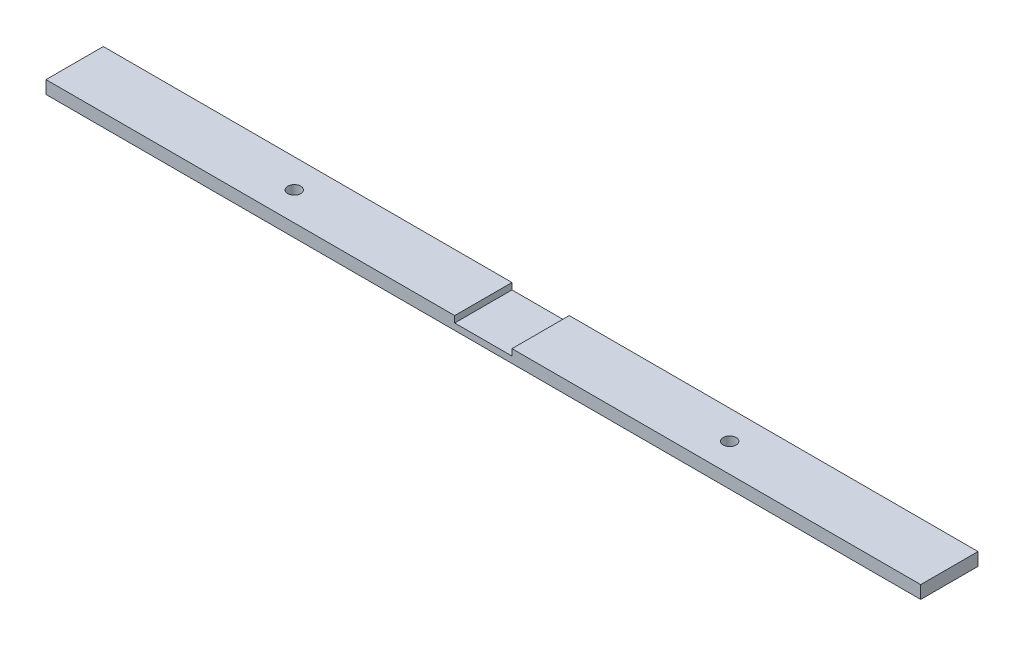
ISO-10303-21;
HEADER;
FILE_DESCRIPTION(('STEP AP214'),'2;1');
FILE_NAME('part.step','',(''),(''),'','','');
FILE_SCHEMA(('AUTOMOTIVE_DESIGN { 1 0 10303 214 1 1 1 1 }'));
ENDSEC;
DATA;
#1=APPLICATION_CONTEXT('core data for automotive mechanical design processes');
#2=APPLICATION_PROTOCOL_DEFINITION('international standard','automotive_design',2000,#1);
#3=PRODUCT_CONTEXT('',#1,'mechanical');
#4=PRODUCT('Part','Part','',(#3));
#5=PRODUCT_RELATED_PRODUCT_CATEGORY('part','',(#4));
#6=PRODUCT_DEFINITION_FORMATION('','',#4);
#7=PRODUCT_DEFINITION_CONTEXT('part definition',#1,'design');
#8=PRODUCT_DEFINITION('design','',#6,#7);
#9=PRODUCT_DEFINITION_SHAPE('','',#8);
#10=(LENGTH_UNIT() NAMED_UNIT(*) SI_UNIT(.MILLI.,.METRE.));
#11=(NAMED_UNIT(*) PLANE_ANGLE_UNIT() SI_UNIT($,.RADIAN.));
#12=(NAMED_UNIT(*) SI_UNIT($,.STERADIAN.) SOLID_ANGLE_UNIT());
#13=UNCERTAINTY_MEASURE_WITH_UNIT(LENGTH_MEASURE(1.E-05),#10,'distance_accuracy_value','');
#14=(GEOMETRIC_REPRESENTATION_CONTEXT(3) GLOBAL_UNCERTAINTY_ASSIGNED_CONTEXT((#13)) GLOBAL_UNIT_ASSIGNED_CONTEXT((#10,
#11,#12)) REPRESENTATION_CONTEXT('',''));
#15=CARTESIAN_POINT('',(0.,0.,0.));
#16=DIRECTION('',(0.,0.,1.));
#17=DIRECTION('',(1.,0.,0.));
#18=AXIS2_PLACEMENT_3D('',#15,#16,#17);
#19=CARTESIAN_POINT('',(0.,3.375,0.));
#20=DIRECTION('',(0.,-1.,0.));
#21=DIRECTION('',(0.,0.,-1.));
#22=AXIS2_PLACEMENT_3D('',#19,#20,#21);
#23=PLANE('',#22);
#24=CARTESIAN_POINT('',(-57.,3.375,0.));
#25=DIRECTION('',(0.,-1.,0.));
#26=DIRECTION('',(0.,0.,-1.));
#27=AXIS2_PLACEMENT_3D('',#24,#25,#26);
#28=CIRCLE('',#27,1.7);
#29=CARTESIAN_POINT('',(-57.,3.375,-1.7));
#30=VERTEX_POINT('',#29);
#31=EDGE_CURVE('E145',#30,#30,#28,.T.);
#32=ORIENTED_EDGE('',*,*,#31,.T.);
#33=EDGE_LOOP('',(#32));
#34=FACE_BOUND('',#33,.T.);
#35=DIRECTION('',(1.,0.,0.));
#36=VECTOR('',#35,1.);
#37=CARTESIAN_POINT('',(-114.5,3.375,7.5));
#38=LINE('',#37,#36);
#39=CARTESIAN_POINT('',(-114.5,3.375,7.5));
#40=VERTEX_POINT('',#39);
#41=CARTESIAN_POINT('',(-7.5,3.37500000000001,7.5));
#42=VERTEX_POINT('',#41);
#43=EDGE_CURVE('E160',#40,#42,#38,.T.);
#44=ORIENTED_EDGE('',*,*,#43,.T.);
#45=DIRECTION('',(0.,0.,1.));
#46=VECTOR('',#45,1.);
#47=CARTESIAN_POINT('',(-7.5,3.37500000000001,-7.5));
#48=LINE('',#47,#46);
#49=CARTESIAN_POINT('',(-7.5,3.37500000000001,-7.5));
#50=VERTEX_POINT('',#49);
#51=EDGE_CURVE('E135',#50,#42,#48,.T.);
#52=ORIENTED_EDGE('',*,*,#51,.F.);
#53=DIRECTION('',(-1.,0.,0.));
#54=VECTOR('',#53,1.);
#55=CARTESIAN_POINT('',(-114.5,3.375,-7.5));
#56=LINE('',#55,#54);
#57=CARTESIAN_POINT('',(-114.5,3.375,-7.5));
#58=VERTEX_POINT('',#57);
#59=EDGE_CURVE('E131',#50,#58,#56,.T.);
#60=ORIENTED_EDGE('',*,*,#59,.T.);
#61=DIRECTION('',(0.,0.,1.));
#62=VECTOR('',#61,1.);
#63=CARTESIAN_POINT('',(-114.5,3.375,7.5));
#64=LINE('',#63,#62);
#65=EDGE_CURVE('E158',#58,#40,#64,.T.);
#66=ORIENTED_EDGE('',*,*,#65,.T.);
#67=EDGE_LOOP('',(#44,#52,#60,#66));
#68=FACE_BOUND('',#67,.T.);
#69=ADVANCED_FACE('F35',(#34,#68),#23,.F.);
#70=CARTESIAN_POINT('',(114.5,3.375,7.5));
#71=DIRECTION('',(-1.,0.,0.));
#72=DIRECTION('',(0.,0.,1.));
#73=AXIS2_PLACEMENT_3D('',#70,#71,#72);
#74=PLANE('',#73);
#75=DIRECTION('',(0.,0.,-1.));
#76=VECTOR('',#75,1.);
#77=CARTESIAN_POINT('',(114.5,0.,7.5));
#78=LINE('',#77,#76);
#79=CARTESIAN_POINT('',(114.5,0.,7.5));
#80=VERTEX_POINT('',#79);
#81=CARTESIAN_POINT('',(114.5,0.,-7.5));
#82=VERTEX_POINT('',#81);
#83=EDGE_CURVE('E154',#80,#82,#78,.T.);
#84=ORIENTED_EDGE('',*,*,#83,.T.);
#85=DIRECTION('',(0.,-1.,0.));
#86=VECTOR('',#85,1.);
#87=CARTESIAN_POINT('',(114.5,3.375,-7.5));
#88=LINE('',#87,#86);
#89=CARTESIAN_POINT('',(114.5,3.375,-7.5));
#90=VERTEX_POINT('',#89);
#91=EDGE_CURVE('E43',#90,#82,#88,.T.);
#92=ORIENTED_EDGE('',*,*,#91,.F.);
#93=DIRECTION('',(0.,0.,-1.));
#94=VECTOR('',#93,1.);
#95=CARTESIAN_POINT('',(114.5,3.375,7.5));
#96=LINE('',#95,#94);
#97=CARTESIAN_POINT('',(114.5,3.375,7.5));
#98=VERTEX_POINT('',#97);
#99=EDGE_CURVE('E155',#98,#90,#96,.T.);
#100=ORIENTED_EDGE('',*,*,#99,.F.);
#101=DIRECTION('',(0.,-1.,0.));
#102=VECTOR('',#101,1.);
#103=CARTESIAN_POINT('',(114.5,3.375,7.5));
#104=LINE('',#103,#102);
#105=EDGE_CURVE('E163',#98,#80,#104,.T.);
#106=ORIENTED_EDGE('',*,*,#105,.T.);
#107=EDGE_LOOP('',(#84,#92,#100,#106));
#108=FACE_BOUND('',#107,.T.);
#109=ADVANCED_FACE('F37',(#108),#74,.F.);
#110=CARTESIAN_POINT('',(-114.5,3.375,-7.5));
#111=DIRECTION('',(0.,0.,1.));
#112=DIRECTION('',(1.,0.,0.));
#113=AXIS2_PLACEMENT_3D('',#110,#111,#112);
#114=PLANE('',#113);
#115=ORIENTED_EDGE('',*,*,#59,.F.);
#116=DIRECTION('',(0.,-1.,0.));
#117=VECTOR('',#116,1.);
#118=CARTESIAN_POINT('',(-7.5,1.6875,-7.5));
#119=LINE('',#118,#117);
#120=CARTESIAN_POINT('',(-7.5,1.6875,-7.5));
#121=VERTEX_POINT('',#120);
#122=EDGE_CURVE('E115',#50,#121,#119,.T.);
#123=ORIENTED_EDGE('',*,*,#122,.T.);
#124=DIRECTION('',(1.,0.,0.));
#125=VECTOR('',#124,1.);
#126=CARTESIAN_POINT('',(-7.5,1.6875,-7.5));
#127=LINE('',#126,#125);
#128=CARTESIAN_POINT('',(7.5,1.6875,-7.5));
#129=VERTEX_POINT('',#128);
#130=EDGE_CURVE('E124',#121,#129,#127,.T.);
#131=ORIENTED_EDGE('',*,*,#130,.T.);
#132=DIRECTION('',(0.,1.,0.));
#133=VECTOR('',#132,1.);
#134=CARTESIAN_POINT('',(7.5,3.37500000000001,-7.5));
#135=LINE('',#134,#133);
#136=CARTESIAN_POINT('',(7.5,3.37500000000001,-7.5));
#137=VERTEX_POINT('',#136);
#138=EDGE_CURVE('E121',#129,#137,#135,.T.);
#139=ORIENTED_EDGE('',*,*,#138,.T.);
#140=EDGE_CURVE('E88',#90,#137,#56,.T.);
#141=ORIENTED_EDGE('',*,*,#140,.F.);
#142=ORIENTED_EDGE('',*,*,#91,.T.);
#143=DIRECTION('',(-1.,0.,0.));
#144=VECTOR('',#143,1.);
#145=CARTESIAN_POINT('',(-114.5,0.,-7.5));
#146=LINE('',#145,#144);
#147=CARTESIAN_POINT('',(-114.5,0.,-7.5));
#148=VERTEX_POINT('',#147);
#149=EDGE_CURVE('E166',#82,#148,#146,.T.);
#150=ORIENTED_EDGE('',*,*,#149,.T.);
#151=DIRECTION('',(0.,-1.,0.));
#152=VECTOR('',#151,1.);
#153=CARTESIAN_POINT('',(-114.5,3.375,-7.5));
#154=LINE('',#153,#152);
#155=EDGE_CURVE('E174',#58,#148,#154,.T.);
#156=ORIENTED_EDGE('',*,*,#155,.F.);
#157=EDGE_LOOP('',(#115,#123,#131,#139,#141,#142,#150,#156));
#158=FACE_BOUND('',#157,.T.);
#159=ADVANCED_FACE('F129',(#158),#114,.F.);
#160=CARTESIAN_POINT('',(-114.5,3.375,7.5));
#161=DIRECTION('',(1.,0.,0.));
#162=DIRECTION('',(0.,0.,-1.));
#163=AXIS2_PLACEMENT_3D('',#160,#161,#162);
#164=PLANE('',#163);
#165=DIRECTION('',(0.,0.,1.));
#166=VECTOR('',#165,1.);
#167=CARTESIAN_POINT('',(-114.5,0.,7.5));
#168=LINE('',#167,#166);
#169=CARTESIAN_POINT('',(-114.5,0.,7.5));
#170=VERTEX_POINT('',#169);
#171=EDGE_CURVE('E168',#148,#170,#168,.T.);
#172=ORIENTED_EDGE('',*,*,#171,.T.);
#173=DIRECTION('',(0.,-1.,0.));
#174=VECTOR('',#173,1.);
#175=CARTESIAN_POINT('',(-114.5,3.375,7.5));
#176=LINE('',#175,#174);
#177=EDGE_CURVE('E172',#40,#170,#176,.T.);
#178=ORIENTED_EDGE('',*,*,#177,.F.);
#179=ORIENTED_EDGE('',*,*,#65,.F.);
#180=ORIENTED_EDGE('',*,*,#155,.T.);
#181=EDGE_LOOP('',(#172,#178,#179,#180));
#182=FACE_BOUND('',#181,.T.);
#183=ADVANCED_FACE('F185',(#182),#164,.F.);
#184=CARTESIAN_POINT('',(-114.5,3.375,7.5));
#185=DIRECTION('',(0.,0.,-1.));
#186=DIRECTION('',(-1.,0.,0.));
#187=AXIS2_PLACEMENT_3D('',#184,#185,#186);
#188=PLANE('',#187);
#189=DIRECTION('',(-1.,0.,0.));
#190=VECTOR('',#189,1.);
#191=CARTESIAN_POINT('',(-114.5,1.6875,7.5));
#192=LINE('',#191,#190);
#193=CARTESIAN_POINT('',(7.5,1.6875,7.5));
#194=VERTEX_POINT('',#193);
#195=CARTESIAN_POINT('',(-7.5,1.6875,7.5));
#196=VERTEX_POINT('',#195);
#197=EDGE_CURVE('E11',#194,#196,#192,.T.);
#198=ORIENTED_EDGE('',*,*,#197,.T.);
#199=DIRECTION('',(0.,1.,0.));
#200=VECTOR('',#199,1.);
#201=CARTESIAN_POINT('',(-7.49999999999999,3.375,7.5));
#202=LINE('',#201,#200);
#203=EDGE_CURVE('E118',#196,#42,#202,.T.);
#204=ORIENTED_EDGE('',*,*,#203,.T.);
#205=ORIENTED_EDGE('',*,*,#43,.F.);
#206=ORIENTED_EDGE('',*,*,#177,.T.);
#207=DIRECTION('',(1.,0.,0.));
#208=VECTOR('',#207,1.);
#209=CARTESIAN_POINT('',(-114.5,0.,7.5));
#210=LINE('',#209,#208);
#211=EDGE_CURVE('E80',#170,#80,#210,.T.);
#212=ORIENTED_EDGE('',*,*,#211,.T.);
#213=ORIENTED_EDGE('',*,*,#105,.F.);
#214=CARTESIAN_POINT('',(7.49999999999997,3.375,7.5));
#215=VERTEX_POINT('',#214);
#216=EDGE_CURVE('E58',#215,#98,#38,.T.);
#217=ORIENTED_EDGE('',*,*,#216,.F.);
#218=DIRECTION('',(0.,-1.,0.));
#219=VECTOR('',#218,1.);
#220=CARTESIAN_POINT('',(7.49999999999999,3.375,7.5));
#221=LINE('',#220,#219);
#222=EDGE_CURVE('E50',#215,#194,#221,.T.);
#223=ORIENTED_EDGE('',*,*,#222,.T.);
#224=EDGE_LOOP('',(#198,#204,#205,#206,#212,#213,#217,#223));
#225=FACE_BOUND('',#224,.T.);
#226=ADVANCED_FACE('F188',(#225),#188,.F.);
#227=CARTESIAN_POINT('',(57.,3.375,0.));
#228=DIRECTION('',(0.,-1.,0.));
#229=DIRECTION('',(0.,0.,-1.));
#230=AXIS2_PLACEMENT_3D('',#227,#228,#229);
#231=CIRCLE('',#230,1.7);
#232=CARTESIAN_POINT('',(57.,3.375,-1.70000000000002));
#233=VERTEX_POINT('',#232);
#234=EDGE_CURVE('E151',#233,#233,#231,.T.);
#235=ORIENTED_EDGE('',*,*,#234,.T.);
#236=EDGE_LOOP('',(#235));
#237=FACE_BOUND('',#236,.T.);
#238=ORIENTED_EDGE('',*,*,#140,.T.);
#239=DIRECTION('',(0.,0.,1.));
#240=VECTOR('',#239,1.);
#241=CARTESIAN_POINT('',(7.5,3.37500000000001,-7.5));
#242=LINE('',#241,#240);
#243=EDGE_CURVE('E137',#137,#215,#242,.T.);
#244=ORIENTED_EDGE('',*,*,#243,.T.);
#245=ORIENTED_EDGE('',*,*,#216,.T.);
#246=ORIENTED_EDGE('',*,*,#99,.T.);
#247=EDGE_LOOP('',(#238,#244,#245,#246));
#248=FACE_BOUND('',#247,.T.);
#249=ADVANCED_FACE('F193',(#237,#248),#23,.F.);
#250=CARTESIAN_POINT('',(0.,0.,0.));
#251=DIRECTION('',(0.,-1.,0.));
#252=DIRECTION('',(0.,0.,-1.));
#253=AXIS2_PLACEMENT_3D('',#250,#251,#252);
#254=PLANE('',#253);
#255=CARTESIAN_POINT('',(-57.,0.,0.));
#256=DIRECTION('',(0.,-1.,0.));
#257=DIRECTION('',(0.,0.,-1.));
#258=AXIS2_PLACEMENT_3D('',#255,#256,#257);
#259=CIRCLE('',#258,1.7);
#260=CARTESIAN_POINT('',(-57.,0.,-1.7));
#261=VERTEX_POINT('',#260);
#262=EDGE_CURVE('E142',#261,#261,#259,.T.);
#263=ORIENTED_EDGE('',*,*,#262,.F.);
#264=EDGE_LOOP('',(#263));
#265=FACE_BOUND('',#264,.T.);
#266=CARTESIAN_POINT('',(57.,0.,0.));
#267=DIRECTION('',(0.,-1.,0.));
#268=DIRECTION('',(0.,0.,-1.));
#269=AXIS2_PLACEMENT_3D('',#266,#267,#268);
#270=CIRCLE('',#269,1.7);
#271=CARTESIAN_POINT('',(57.,0.,-1.70000000000002));
#272=VERTEX_POINT('',#271);
#273=EDGE_CURVE('E148',#272,#272,#270,.T.);
#274=ORIENTED_EDGE('',*,*,#273,.F.);
#275=EDGE_LOOP('',(#274));
#276=FACE_BOUND('',#275,.T.);
#277=ORIENTED_EDGE('',*,*,#83,.F.);
#278=ORIENTED_EDGE('',*,*,#211,.F.);
#279=ORIENTED_EDGE('',*,*,#171,.F.);
#280=ORIENTED_EDGE('',*,*,#149,.F.);
#281=EDGE_LOOP('',(#277,#278,#279,#280));
#282=FACE_BOUND('',#281,.T.);
#283=ADVANCED_FACE('F181',(#265,#276,#282),#254,.T.);
#284=CARTESIAN_POINT('',(57.,0.,0.));
#285=DIRECTION('',(0.,-1.,0.));
#286=DIRECTION('',(0.,0.,-1.));
#287=AXIS2_PLACEMENT_3D('',#284,#285,#286);
#288=CYLINDRICAL_SURFACE('',#287,1.7);
#289=ORIENTED_EDGE('',*,*,#234,.F.);
#290=EDGE_LOOP('',(#289));
#291=FACE_BOUND('',#290,.T.);
#292=ORIENTED_EDGE('',*,*,#273,.T.);
#293=EDGE_LOOP('',(#292));
#294=FACE_BOUND('',#293,.T.);
#295=ADVANCED_FACE('F205',(#291,#294),#288,.F.);
#296=CARTESIAN_POINT('',(-57.,0.,0.));
#297=DIRECTION('',(0.,-1.,0.));
#298=DIRECTION('',(0.,0.,-1.));
#299=AXIS2_PLACEMENT_3D('',#296,#297,#298);
#300=CYLINDRICAL_SURFACE('',#299,1.7);
#301=ORIENTED_EDGE('',*,*,#31,.F.);
#302=EDGE_LOOP('',(#301));
#303=FACE_BOUND('',#302,.T.);
#304=ORIENTED_EDGE('',*,*,#262,.T.);
#305=EDGE_LOOP('',(#304));
#306=FACE_BOUND('',#305,.T.);
#307=ADVANCED_FACE('F218',(#303,#306),#300,.F.);
#308=CARTESIAN_POINT('',(-7.5,1.6875,-7.5));
#309=DIRECTION('',(0.,-1.,0.));
#310=DIRECTION('',(0.,0.,-1.));
#311=AXIS2_PLACEMENT_3D('',#308,#309,#310);
#312=PLANE('',#311);
#313=DIRECTION('',(0.,0.,1.));
#314=VECTOR('',#313,1.);
#315=CARTESIAN_POINT('',(7.5,1.6875,-7.5));
#316=LINE('',#315,#314);
#317=EDGE_CURVE('E120',#129,#194,#316,.T.);
#318=ORIENTED_EDGE('',*,*,#317,.F.);
#319=ORIENTED_EDGE('',*,*,#130,.F.);
#320=DIRECTION('',(0.,0.,1.));
#321=VECTOR('',#320,1.);
#322=CARTESIAN_POINT('',(-7.5,1.6875,-7.5));
#323=LINE('',#322,#321);
#324=EDGE_CURVE('E111',#121,#196,#323,.T.);
#325=ORIENTED_EDGE('',*,*,#324,.T.);
#326=ORIENTED_EDGE('',*,*,#197,.F.);
#327=EDGE_LOOP('',(#318,#319,#325,#326));
#328=FACE_BOUND('',#327,.T.);
#329=ADVANCED_FACE('F125',(#328),#312,.F.);
#330=CARTESIAN_POINT('',(-7.5,1.6875,-7.5));
#331=DIRECTION('',(-1.,0.,0.));
#332=DIRECTION('',(0.,0.,1.));
#333=AXIS2_PLACEMENT_3D('',#330,#331,#332);
#334=PLANE('',#333);
#335=ORIENTED_EDGE('',*,*,#324,.F.);
#336=ORIENTED_EDGE('',*,*,#122,.F.);
#337=ORIENTED_EDGE('',*,*,#51,.T.);
#338=ORIENTED_EDGE('',*,*,#203,.F.);
#339=EDGE_LOOP('',(#335,#336,#337,#338));
#340=FACE_BOUND('',#339,.T.);
#341=ADVANCED_FACE('F113',(#340),#334,.F.);
#342=CARTESIAN_POINT('',(7.5,3.37500000000001,-7.5));
#343=DIRECTION('',(1.,0.,0.));
#344=DIRECTION('',(0.,0.,-1.));
#345=AXIS2_PLACEMENT_3D('',#342,#343,#344);
#346=PLANE('',#345);
#347=ORIENTED_EDGE('',*,*,#243,.F.);
#348=ORIENTED_EDGE('',*,*,#138,.F.);
#349=ORIENTED_EDGE('',*,*,#317,.T.);
#350=ORIENTED_EDGE('',*,*,#222,.F.);
#351=EDGE_LOOP('',(#347,#348,#349,#350));
#352=FACE_BOUND('',#351,.T.);
#353=ADVANCED_FACE('F209',(#352),#346,.F.);
#354=CLOSED_SHELL('',(#69,#109,#159,#183,#226,#249,#283,#295,#307,#329,#341,#353));
#355=MANIFOLD_SOLID_BREP('B2',#354);
#356=ADVANCED_BREP_SHAPE_REPRESENTATION('',(#18,#355),#14);
#357=SHAPE_DEFINITION_REPRESENTATION(#9,#356);
ENDSEC;
END-ISO-10303-21;
